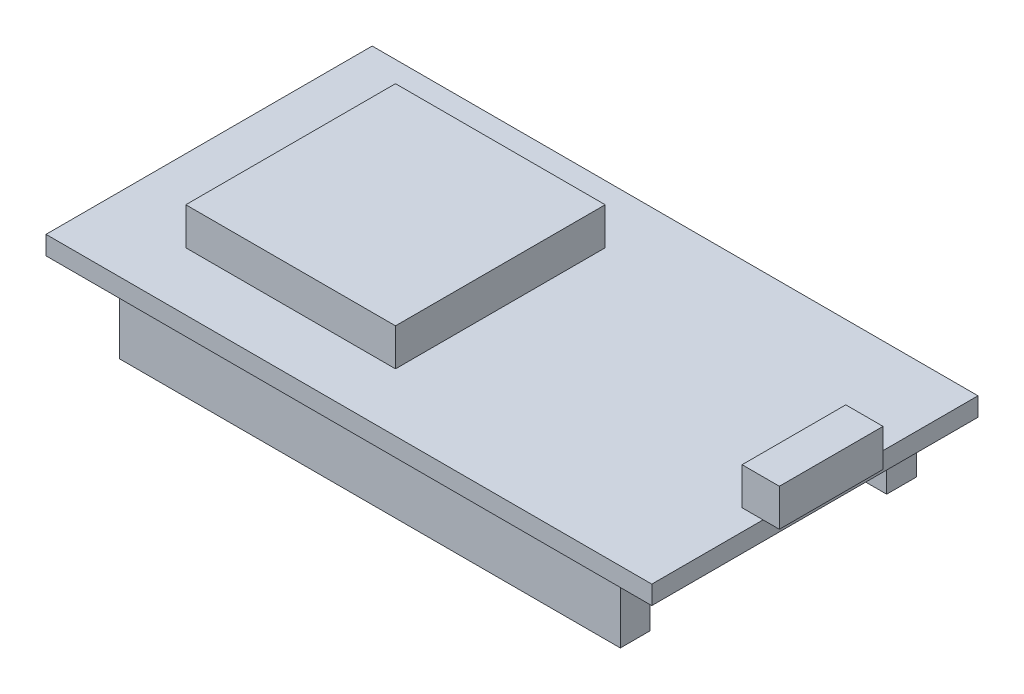
ISO-10303-21;
HEADER;
FILE_DESCRIPTION(('STEP AP214'),'2;1');
FILE_NAME('part.step','',(''),(''),'','','');
FILE_SCHEMA(('AUTOMOTIVE_DESIGN { 1 0 10303 214 1 1 1 1 }'));
ENDSEC;
DATA;
#1=APPLICATION_CONTEXT('core data for automotive mechanical design processes');
#2=APPLICATION_PROTOCOL_DEFINITION('international standard','automotive_design',2000,#1);
#3=PRODUCT_CONTEXT('',#1,'mechanical');
#4=PRODUCT('Part','Part','',(#3));
#5=PRODUCT_RELATED_PRODUCT_CATEGORY('part','',(#4));
#6=PRODUCT_DEFINITION_FORMATION('','',#4);
#7=PRODUCT_DEFINITION_CONTEXT('part definition',#1,'design');
#8=PRODUCT_DEFINITION('design','',#6,#7);
#9=PRODUCT_DEFINITION_SHAPE('','',#8);
#10=(LENGTH_UNIT() NAMED_UNIT(*) SI_UNIT(.MILLI.,.METRE.));
#11=(NAMED_UNIT(*) PLANE_ANGLE_UNIT() SI_UNIT($,.RADIAN.));
#12=(NAMED_UNIT(*) SI_UNIT($,.STERADIAN.) SOLID_ANGLE_UNIT());
#13=UNCERTAINTY_MEASURE_WITH_UNIT(LENGTH_MEASURE(1.E-05),#10,'distance_accuracy_value','');
#14=(GEOMETRIC_REPRESENTATION_CONTEXT(3) GLOBAL_UNCERTAINTY_ASSIGNED_CONTEXT((#13)) GLOBAL_UNIT_ASSIGNED_CONTEXT((#10,
#11,#12)) REPRESENTATION_CONTEXT('',''));
#15=CARTESIAN_POINT('',(0.,0.,0.));
#16=DIRECTION('',(0.,0.,1.));
#17=DIRECTION('',(1.,0.,0.));
#18=AXIS2_PLACEMENT_3D('',#15,#16,#17);
#19=CARTESIAN_POINT('',(0.,10.6,0.));
#20=DIRECTION('',(0.,-1.,0.));
#21=DIRECTION('',(0.,0.,-1.));
#22=AXIS2_PLACEMENT_3D('',#19,#20,#21);
#23=PLANE('',#22);
#24=DIRECTION('',(0.,0.,1.));
#25=VECTOR('',#24,1.);
#26=CARTESIAN_POINT('',(16.,10.6,9.));
#27=LINE('',#26,#25);
#28=CARTESIAN_POINT('',(16.,10.6,-9.));
#29=VERTEX_POINT('',#28);
#30=CARTESIAN_POINT('',(16.,10.6,9.));
#31=VERTEX_POINT('',#30);
#32=EDGE_CURVE('E278',#29,#31,#27,.T.);
#33=ORIENTED_EDGE('',*,*,#32,.F.);
#34=DIRECTION('',(-1.,0.,0.));
#35=VECTOR('',#34,1.);
#36=CARTESIAN_POINT('',(16.,10.6,-9.));
#37=LINE('',#36,#35);
#38=CARTESIAN_POINT('',(34.,10.6,-9.));
#39=VERTEX_POINT('',#38);
#40=EDGE_CURVE('E283',#39,#29,#37,.T.);
#41=ORIENTED_EDGE('',*,*,#40,.F.);
#42=DIRECTION('',(0.,0.,-1.));
#43=VECTOR('',#42,1.);
#44=CARTESIAN_POINT('',(34.,10.6,-9.));
#45=LINE('',#44,#43);
#46=CARTESIAN_POINT('',(34.,10.6,9.));
#47=VERTEX_POINT('',#46);
#48=EDGE_CURVE('E295',#47,#39,#45,.T.);
#49=ORIENTED_EDGE('',*,*,#48,.F.);
#50=DIRECTION('',(1.,0.,0.));
#51=VECTOR('',#50,1.);
#52=CARTESIAN_POINT('',(34.,10.6,9.));
#53=LINE('',#52,#51);
#54=EDGE_CURVE('E292',#31,#47,#53,.T.);
#55=ORIENTED_EDGE('',*,*,#54,.F.);
#56=EDGE_LOOP('',(#33,#41,#49,#55));
#57=FACE_BOUND('',#56,.T.);
#58=DIRECTION('',(1.,0.,0.));
#59=VECTOR('',#58,1.);
#60=CARTESIAN_POINT('',(62.4,10.6,4.45));
#61=LINE('',#60,#59);
#62=CARTESIAN_POINT('',(59.2,10.6,4.45));
#63=VERTEX_POINT('',#62);
#64=CARTESIAN_POINT('',(61.,10.6,4.45));
#65=VERTEX_POINT('',#64);
#66=EDGE_CURVE('E259',#63,#65,#61,.T.);
#67=ORIENTED_EDGE('',*,*,#66,.F.);
#68=DIRECTION('',(0.,0.,1.));
#69=VECTOR('',#68,1.);
#70=CARTESIAN_POINT('',(59.2,10.6,4.45));
#71=LINE('',#70,#69);
#72=CARTESIAN_POINT('',(59.2,10.6,-4.45));
#73=VERTEX_POINT('',#72);
#74=EDGE_CURVE('E236',#73,#63,#71,.T.);
#75=ORIENTED_EDGE('',*,*,#74,.F.);
#76=DIRECTION('',(-1.,0.,0.));
#77=VECTOR('',#76,1.);
#78=CARTESIAN_POINT('',(59.2,10.6,-4.45));
#79=LINE('',#78,#77);
#80=CARTESIAN_POINT('',(61.,10.6,-4.45));
#81=VERTEX_POINT('',#80);
#82=EDGE_CURVE('E264',#81,#73,#79,.T.);
#83=ORIENTED_EDGE('',*,*,#82,.F.);
#84=DIRECTION('',(0.,0.,-1.));
#85=VECTOR('',#84,1.);
#86=CARTESIAN_POINT('',(61.,10.6,-14.));
#87=LINE('',#86,#85);
#88=CARTESIAN_POINT('',(61.,10.6,-14.));
#89=VERTEX_POINT('',#88);
#90=EDGE_CURVE('E318',#81,#89,#87,.T.);
#91=ORIENTED_EDGE('',*,*,#90,.T.);
#92=DIRECTION('',(-1.,0.,0.));
#93=VECTOR('',#92,1.);
#94=CARTESIAN_POINT('',(9.,10.6,-14.));
#95=LINE('',#94,#93);
#96=CARTESIAN_POINT('',(9.,10.6,-14.));
#97=VERTEX_POINT('',#96);
#98=EDGE_CURVE('E322',#89,#97,#95,.T.);
#99=ORIENTED_EDGE('',*,*,#98,.T.);
#100=DIRECTION('',(0.,0.,1.));
#101=VECTOR('',#100,1.);
#102=CARTESIAN_POINT('',(9.,10.6,14.));
#103=LINE('',#102,#101);
#104=CARTESIAN_POINT('',(9.,10.6,14.));
#105=VERTEX_POINT('',#104);
#106=EDGE_CURVE('E312',#97,#105,#103,.T.);
#107=ORIENTED_EDGE('',*,*,#106,.T.);
#108=DIRECTION('',(1.,0.,0.));
#109=VECTOR('',#108,1.);
#110=CARTESIAN_POINT('',(61.,10.6,14.));
#111=LINE('',#110,#109);
#112=CARTESIAN_POINT('',(61.,10.6,14.));
#113=VERTEX_POINT('',#112);
#114=EDGE_CURVE('E315',#105,#113,#111,.T.);
#115=ORIENTED_EDGE('',*,*,#114,.T.);
#116=EDGE_CURVE('E319',#113,#65,#87,.T.);
#117=ORIENTED_EDGE('',*,*,#116,.T.);
#118=EDGE_LOOP('',(#67,#75,#83,#91,#99,#107,#115,#117));
#119=FACE_BOUND('',#118,.T.);
#120=ADVANCED_FACE('F39',(#57,#119),#23,.F.);
#121=CARTESIAN_POINT('',(9.,10.6,14.));
#122=DIRECTION('',(1.,0.,0.));
#123=DIRECTION('',(0.,0.,-1.));
#124=AXIS2_PLACEMENT_3D('',#121,#122,#123);
#125=PLANE('',#124);
#126=DIRECTION('',(0.,0.,1.));
#127=VECTOR('',#126,1.);
#128=CARTESIAN_POINT('',(9.,9.,14.));
#129=LINE('',#128,#127);
#130=CARTESIAN_POINT('',(9.,9.,-14.));
#131=VERTEX_POINT('',#130);
#132=CARTESIAN_POINT('',(9.,9.,14.));
#133=VERTEX_POINT('',#132);
#134=EDGE_CURVE('E311',#131,#133,#129,.T.);
#135=ORIENTED_EDGE('',*,*,#134,.T.);
#136=DIRECTION('',(0.,-1.,0.));
#137=VECTOR('',#136,1.);
#138=CARTESIAN_POINT('',(9.,10.6,14.));
#139=LINE('',#138,#137);
#140=EDGE_CURVE('E11',#105,#133,#139,.T.);
#141=ORIENTED_EDGE('',*,*,#140,.F.);
#142=ORIENTED_EDGE('',*,*,#106,.F.);
#143=DIRECTION('',(0.,-1.,0.));
#144=VECTOR('',#143,1.);
#145=CARTESIAN_POINT('',(9.,10.6,-14.));
#146=LINE('',#145,#144);
#147=EDGE_CURVE('E325',#97,#131,#146,.T.);
#148=ORIENTED_EDGE('',*,*,#147,.T.);
#149=EDGE_LOOP('',(#135,#141,#142,#148));
#150=FACE_BOUND('',#149,.T.);
#151=ADVANCED_FACE('F41',(#150),#125,.F.);
#152=CARTESIAN_POINT('',(61.,10.6,14.));
#153=DIRECTION('',(0.,0.,-1.));
#154=DIRECTION('',(-1.,0.,0.));
#155=AXIS2_PLACEMENT_3D('',#152,#153,#154);
#156=PLANE('',#155);
#157=DIRECTION('',(1.,0.,0.));
#158=VECTOR('',#157,1.);
#159=CARTESIAN_POINT('',(61.,9.,14.));
#160=LINE('',#159,#158);
#161=CARTESIAN_POINT('',(61.,9.,14.));
#162=VERTEX_POINT('',#161);
#163=EDGE_CURVE('E328',#133,#162,#160,.T.);
#164=ORIENTED_EDGE('',*,*,#163,.T.);
#165=DIRECTION('',(0.,-1.,0.));
#166=VECTOR('',#165,1.);
#167=CARTESIAN_POINT('',(61.,10.6,14.));
#168=LINE('',#167,#166);
#169=EDGE_CURVE('E47',#113,#162,#168,.T.);
#170=ORIENTED_EDGE('',*,*,#169,.F.);
#171=ORIENTED_EDGE('',*,*,#114,.F.);
#172=ORIENTED_EDGE('',*,*,#140,.T.);
#173=EDGE_LOOP('',(#164,#170,#171,#172));
#174=FACE_BOUND('',#173,.T.);
#175=ADVANCED_FACE('F402',(#174),#156,.F.);
#176=CARTESIAN_POINT('',(61.,10.6,-14.));
#177=DIRECTION('',(-1.,0.,0.));
#178=DIRECTION('',(0.,0.,1.));
#179=AXIS2_PLACEMENT_3D('',#176,#177,#178);
#180=PLANE('',#179);
#181=DIRECTION('',(0.,0.,-1.));
#182=VECTOR('',#181,1.);
#183=CARTESIAN_POINT('',(61.,9.,-14.));
#184=LINE('',#183,#182);
#185=CARTESIAN_POINT('',(61.,9.,-14.));
#186=VERTEX_POINT('',#185);
#187=EDGE_CURVE('E330',#162,#186,#184,.T.);
#188=ORIENTED_EDGE('',*,*,#187,.T.);
#189=DIRECTION('',(0.,-1.,0.));
#190=VECTOR('',#189,1.);
#191=CARTESIAN_POINT('',(61.,10.6,-14.));
#192=LINE('',#191,#190);
#193=EDGE_CURVE('E335',#89,#186,#192,.T.);
#194=ORIENTED_EDGE('',*,*,#193,.F.);
#195=ORIENTED_EDGE('',*,*,#90,.F.);
#196=EDGE_CURVE('E323',#65,#81,#87,.T.);
#197=ORIENTED_EDGE('',*,*,#196,.F.);
#198=ORIENTED_EDGE('',*,*,#116,.F.);
#199=ORIENTED_EDGE('',*,*,#169,.T.);
#200=EDGE_LOOP('',(#188,#194,#195,#197,#198,#199));
#201=FACE_BOUND('',#200,.T.);
#202=ADVANCED_FACE('F342',(#201),#180,.F.);
#203=CARTESIAN_POINT('',(9.,10.6,-14.));
#204=DIRECTION('',(0.,0.,1.));
#205=DIRECTION('',(1.,0.,0.));
#206=AXIS2_PLACEMENT_3D('',#203,#204,#205);
#207=PLANE('',#206);
#208=DIRECTION('',(-1.,0.,0.));
#209=VECTOR('',#208,1.);
#210=CARTESIAN_POINT('',(9.,9.,-14.));
#211=LINE('',#210,#209);
#212=EDGE_CURVE('E316',#186,#131,#211,.T.);
#213=ORIENTED_EDGE('',*,*,#212,.T.);
#214=ORIENTED_EDGE('',*,*,#147,.F.);
#215=ORIENTED_EDGE('',*,*,#98,.F.);
#216=ORIENTED_EDGE('',*,*,#193,.T.);
#217=EDGE_LOOP('',(#213,#214,#215,#216));
#218=FACE_BOUND('',#217,.T.);
#219=ADVANCED_FACE('F350',(#218),#207,.F.);
#220=CARTESIAN_POINT('',(0.,9.,0.));
#221=DIRECTION('',(0.,-1.,0.));
#222=DIRECTION('',(0.,0.,-1.));
#223=AXIS2_PLACEMENT_3D('',#220,#221,#222);
#224=PLANE('',#223);
#225=DIRECTION('',(0.,0.,1.));
#226=VECTOR('',#225,1.);
#227=CARTESIAN_POINT('',(14.,9.,12.7));
#228=LINE('',#227,#226);
#229=CARTESIAN_POINT('',(14.,9.,10.16));
#230=VERTEX_POINT('',#229);
#231=CARTESIAN_POINT('',(14.,9.,12.7));
#232=VERTEX_POINT('',#231);
#233=EDGE_CURVE('E179',#230,#232,#228,.T.);
#234=ORIENTED_EDGE('',*,*,#233,.T.);
#235=DIRECTION('',(1.,0.,0.));
#236=VECTOR('',#235,1.);
#237=CARTESIAN_POINT('',(57.,9.,12.7));
#238=LINE('',#237,#236);
#239=CARTESIAN_POINT('',(57.,9.,12.7));
#240=VERTEX_POINT('',#239);
#241=EDGE_CURVE('E184',#232,#240,#238,.T.);
#242=ORIENTED_EDGE('',*,*,#241,.T.);
#243=DIRECTION('',(0.,0.,-1.));
#244=VECTOR('',#243,1.);
#245=CARTESIAN_POINT('',(57.,9.,10.16));
#246=LINE('',#245,#244);
#247=CARTESIAN_POINT('',(57.,9.,10.16));
#248=VERTEX_POINT('',#247);
#249=EDGE_CURVE('E59',#240,#248,#246,.T.);
#250=ORIENTED_EDGE('',*,*,#249,.T.);
#251=DIRECTION('',(-1.,0.,0.));
#252=VECTOR('',#251,1.);
#253=CARTESIAN_POINT('',(14.,9.,10.16));
#254=LINE('',#253,#252);
#255=EDGE_CURVE('E54',#248,#230,#254,.T.);
#256=ORIENTED_EDGE('',*,*,#255,.T.);
#257=EDGE_LOOP('',(#234,#242,#250,#256));
#258=FACE_BOUND('',#257,.T.);
#259=DIRECTION('',(0.,0.,1.));
#260=VECTOR('',#259,1.);
#261=CARTESIAN_POINT('',(14.,9.,-10.16));
#262=LINE('',#261,#260);
#263=CARTESIAN_POINT('',(14.,9.,-12.7));
#264=VERTEX_POINT('',#263);
#265=CARTESIAN_POINT('',(14.,9.,-10.16));
#266=VERTEX_POINT('',#265);
#267=EDGE_CURVE('E187',#264,#266,#262,.T.);
#268=ORIENTED_EDGE('',*,*,#267,.T.);
#269=DIRECTION('',(1.,0.,0.));
#270=VECTOR('',#269,1.);
#271=CARTESIAN_POINT('',(57.,9.,-10.16));
#272=LINE('',#271,#270);
#273=CARTESIAN_POINT('',(57.,9.,-10.16));
#274=VERTEX_POINT('',#273);
#275=EDGE_CURVE('E228',#266,#274,#272,.T.);
#276=ORIENTED_EDGE('',*,*,#275,.T.);
#277=DIRECTION('',(0.,0.,-1.));
#278=VECTOR('',#277,1.);
#279=CARTESIAN_POINT('',(57.,9.,-12.7));
#280=LINE('',#279,#278);
#281=CARTESIAN_POINT('',(57.,9.,-12.7));
#282=VERTEX_POINT('',#281);
#283=EDGE_CURVE('E230',#274,#282,#280,.T.);
#284=ORIENTED_EDGE('',*,*,#283,.T.);
#285=DIRECTION('',(-1.,0.,0.));
#286=VECTOR('',#285,1.);
#287=CARTESIAN_POINT('',(14.,9.,-12.7));
#288=LINE('',#287,#286);
#289=EDGE_CURVE('E217',#282,#264,#288,.T.);
#290=ORIENTED_EDGE('',*,*,#289,.T.);
#291=EDGE_LOOP('',(#268,#276,#284,#290));
#292=FACE_BOUND('',#291,.T.);
#293=ORIENTED_EDGE('',*,*,#134,.F.);
#294=ORIENTED_EDGE('',*,*,#212,.F.);
#295=ORIENTED_EDGE('',*,*,#187,.F.);
#296=ORIENTED_EDGE('',*,*,#163,.F.);
#297=EDGE_LOOP('',(#293,#294,#295,#296));
#298=FACE_BOUND('',#297,.T.);
#299=ADVANCED_FACE('F181',(#258,#292,#298),#224,.T.);
#300=CARTESIAN_POINT('',(16.,13.8,9.));
#301=DIRECTION('',(1.,0.,0.));
#302=DIRECTION('',(0.,0.,-1.));
#303=AXIS2_PLACEMENT_3D('',#300,#301,#302);
#304=PLANE('',#303);
#305=ORIENTED_EDGE('',*,*,#32,.T.);
#306=DIRECTION('',(0.,-1.,0.));
#307=VECTOR('',#306,1.);
#308=CARTESIAN_POINT('',(16.,13.8,9.));
#309=LINE('',#308,#307);
#310=CARTESIAN_POINT('',(16.,13.8,9.));
#311=VERTEX_POINT('',#310);
#312=EDGE_CURVE('E308',#311,#31,#309,.T.);
#313=ORIENTED_EDGE('',*,*,#312,.F.);
#314=DIRECTION('',(0.,0.,1.));
#315=VECTOR('',#314,1.);
#316=CARTESIAN_POINT('',(16.,13.8,9.));
#317=LINE('',#316,#315);
#318=CARTESIAN_POINT('',(16.,13.8,-9.));
#319=VERTEX_POINT('',#318);
#320=EDGE_CURVE('E279',#319,#311,#317,.T.);
#321=ORIENTED_EDGE('',*,*,#320,.F.);
#322=DIRECTION('',(0.,-1.,0.));
#323=VECTOR('',#322,1.);
#324=CARTESIAN_POINT('',(16.,13.8,-9.));
#325=LINE('',#324,#323);
#326=EDGE_CURVE('E289',#319,#29,#325,.T.);
#327=ORIENTED_EDGE('',*,*,#326,.T.);
#328=EDGE_LOOP('',(#305,#313,#321,#327));
#329=FACE_BOUND('',#328,.T.);
#330=ADVANCED_FACE('F405',(#329),#304,.F.);
#331=CARTESIAN_POINT('',(34.,13.8,9.));
#332=DIRECTION('',(0.,0.,-1.));
#333=DIRECTION('',(-1.,0.,0.));
#334=AXIS2_PLACEMENT_3D('',#331,#332,#333);
#335=PLANE('',#334);
#336=ORIENTED_EDGE('',*,*,#54,.T.);
#337=DIRECTION('',(0.,-1.,0.));
#338=VECTOR('',#337,1.);
#339=CARTESIAN_POINT('',(34.,13.8,9.));
#340=LINE('',#339,#338);
#341=CARTESIAN_POINT('',(34.,13.8,9.));
#342=VERTEX_POINT('',#341);
#343=EDGE_CURVE('E305',#342,#47,#340,.T.);
#344=ORIENTED_EDGE('',*,*,#343,.F.);
#345=DIRECTION('',(1.,0.,0.));
#346=VECTOR('',#345,1.);
#347=CARTESIAN_POINT('',(34.,13.8,9.));
#348=LINE('',#347,#346);
#349=EDGE_CURVE('E282',#311,#342,#348,.T.);
#350=ORIENTED_EDGE('',*,*,#349,.F.);
#351=ORIENTED_EDGE('',*,*,#312,.T.);
#352=EDGE_LOOP('',(#336,#344,#350,#351));
#353=FACE_BOUND('',#352,.T.);
#354=ADVANCED_FACE('F429',(#353),#335,.F.);
#355=CARTESIAN_POINT('',(34.,13.8,-9.));
#356=DIRECTION('',(-1.,0.,0.));
#357=DIRECTION('',(0.,0.,1.));
#358=AXIS2_PLACEMENT_3D('',#355,#356,#357);
#359=PLANE('',#358);
#360=ORIENTED_EDGE('',*,*,#48,.T.);
#361=DIRECTION('',(0.,-1.,0.));
#362=VECTOR('',#361,1.);
#363=CARTESIAN_POINT('',(34.,13.8,-9.));
#364=LINE('',#363,#362);
#365=CARTESIAN_POINT('',(34.,13.8,-9.));
#366=VERTEX_POINT('',#365);
#367=EDGE_CURVE('E302',#366,#39,#364,.T.);
#368=ORIENTED_EDGE('',*,*,#367,.F.);
#369=DIRECTION('',(0.,0.,-1.));
#370=VECTOR('',#369,1.);
#371=CARTESIAN_POINT('',(34.,13.8,-9.));
#372=LINE('',#371,#370);
#373=EDGE_CURVE('E285',#342,#366,#372,.T.);
#374=ORIENTED_EDGE('',*,*,#373,.F.);
#375=ORIENTED_EDGE('',*,*,#343,.T.);
#376=EDGE_LOOP('',(#360,#368,#374,#375));
#377=FACE_BOUND('',#376,.T.);
#378=ADVANCED_FACE('F437',(#377),#359,.F.);
#379=CARTESIAN_POINT('',(16.,13.8,-9.));
#380=DIRECTION('',(0.,0.,1.));
#381=DIRECTION('',(1.,0.,0.));
#382=AXIS2_PLACEMENT_3D('',#379,#380,#381);
#383=PLANE('',#382);
#384=ORIENTED_EDGE('',*,*,#40,.T.);
#385=ORIENTED_EDGE('',*,*,#326,.F.);
#386=DIRECTION('',(-1.,0.,0.));
#387=VECTOR('',#386,1.);
#388=CARTESIAN_POINT('',(16.,13.8,-9.));
#389=LINE('',#388,#387);
#390=EDGE_CURVE('E287',#366,#319,#389,.T.);
#391=ORIENTED_EDGE('',*,*,#390,.F.);
#392=ORIENTED_EDGE('',*,*,#367,.T.);
#393=EDGE_LOOP('',(#384,#385,#391,#392));
#394=FACE_BOUND('',#393,.T.);
#395=ADVANCED_FACE('F445',(#394),#383,.F.);
#396=CARTESIAN_POINT('',(0.,13.8,0.));
#397=DIRECTION('',(0.,-1.,0.));
#398=DIRECTION('',(0.,0.,-1.));
#399=AXIS2_PLACEMENT_3D('',#396,#397,#398);
#400=PLANE('',#399);
#401=ORIENTED_EDGE('',*,*,#320,.T.);
#402=ORIENTED_EDGE('',*,*,#349,.T.);
#403=ORIENTED_EDGE('',*,*,#373,.T.);
#404=ORIENTED_EDGE('',*,*,#390,.T.);
#405=EDGE_LOOP('',(#401,#402,#403,#404));
#406=FACE_BOUND('',#405,.T.);
#407=ADVANCED_FACE('F453',(#406),#400,.F.);
#408=CARTESIAN_POINT('',(0.,10.6,0.));
#409=DIRECTION('',(0.,-1.,0.));
#410=DIRECTION('',(0.,0.,-1.));
#411=AXIS2_PLACEMENT_3D('',#408,#409,#410);
#412=PLANE('',#411);
#413=ORIENTED_EDGE('',*,*,#196,.T.);
#414=CARTESIAN_POINT('',(62.4,10.6,-4.45));
#415=VERTEX_POINT('',#414);
#416=EDGE_CURVE('E249',#415,#81,#79,.T.);
#417=ORIENTED_EDGE('',*,*,#416,.F.);
#418=DIRECTION('',(0.,0.,-1.));
#419=VECTOR('',#418,1.);
#420=CARTESIAN_POINT('',(62.4,10.6,-4.45));
#421=LINE('',#420,#419);
#422=CARTESIAN_POINT('',(62.4,10.6,4.45));
#423=VERTEX_POINT('',#422);
#424=EDGE_CURVE('E262',#423,#415,#421,.T.);
#425=ORIENTED_EDGE('',*,*,#424,.F.);
#426=EDGE_CURVE('E258',#65,#423,#61,.T.);
#427=ORIENTED_EDGE('',*,*,#426,.F.);
#428=EDGE_LOOP('',(#413,#417,#425,#427));
#429=FACE_BOUND('',#428,.T.);
#430=ADVANCED_FACE('F362',(#429),#412,.T.);
#431=CARTESIAN_POINT('',(59.2,13.8,4.45));
#432=DIRECTION('',(1.,0.,0.));
#433=DIRECTION('',(0.,0.,-1.));
#434=AXIS2_PLACEMENT_3D('',#431,#432,#433);
#435=PLANE('',#434);
#436=ORIENTED_EDGE('',*,*,#74,.T.);
#437=DIRECTION('',(0.,-1.,0.));
#438=VECTOR('',#437,1.);
#439=CARTESIAN_POINT('',(59.2,13.8,4.45));
#440=LINE('',#439,#438);
#441=CARTESIAN_POINT('',(59.2,13.8,4.45));
#442=VERTEX_POINT('',#441);
#443=EDGE_CURVE('E275',#442,#63,#440,.T.);
#444=ORIENTED_EDGE('',*,*,#443,.F.);
#445=DIRECTION('',(0.,0.,1.));
#446=VECTOR('',#445,1.);
#447=CARTESIAN_POINT('',(59.2,13.8,4.45));
#448=LINE('',#447,#446);
#449=CARTESIAN_POINT('',(59.2,13.8,-4.45));
#450=VERTEX_POINT('',#449);
#451=EDGE_CURVE('E245',#450,#442,#448,.T.);
#452=ORIENTED_EDGE('',*,*,#451,.F.);
#453=DIRECTION('',(0.,-1.,0.));
#454=VECTOR('',#453,1.);
#455=CARTESIAN_POINT('',(59.2,13.8,-4.45));
#456=LINE('',#455,#454);
#457=EDGE_CURVE('E255',#450,#73,#456,.T.);
#458=ORIENTED_EDGE('',*,*,#457,.T.);
#459=EDGE_LOOP('',(#436,#444,#452,#458));
#460=FACE_BOUND('',#459,.T.);
#461=ADVANCED_FACE('F377',(#460),#435,.F.);
#462=CARTESIAN_POINT('',(62.4,13.8,4.45));
#463=DIRECTION('',(0.,0.,-1.));
#464=DIRECTION('',(-1.,0.,0.));
#465=AXIS2_PLACEMENT_3D('',#462,#463,#464);
#466=PLANE('',#465);
#467=ORIENTED_EDGE('',*,*,#66,.T.);
#468=ORIENTED_EDGE('',*,*,#426,.T.);
#469=DIRECTION('',(0.,-1.,0.));
#470=VECTOR('',#469,1.);
#471=CARTESIAN_POINT('',(62.4,13.8,4.45));
#472=LINE('',#471,#470);
#473=CARTESIAN_POINT('',(62.4,13.8,4.45));
#474=VERTEX_POINT('',#473);
#475=EDGE_CURVE('E272',#474,#423,#472,.T.);
#476=ORIENTED_EDGE('',*,*,#475,.F.);
#477=DIRECTION('',(1.,0.,0.));
#478=VECTOR('',#477,1.);
#479=CARTESIAN_POINT('',(62.4,13.8,4.45));
#480=LINE('',#479,#478);
#481=EDGE_CURVE('E248',#442,#474,#480,.T.);
#482=ORIENTED_EDGE('',*,*,#481,.F.);
#483=ORIENTED_EDGE('',*,*,#443,.T.);
#484=EDGE_LOOP('',(#467,#468,#476,#482,#483));
#485=FACE_BOUND('',#484,.T.);
#486=ADVANCED_FACE('F374',(#485),#466,.F.);
#487=CARTESIAN_POINT('',(62.4,13.8,-4.45));
#488=DIRECTION('',(-1.,0.,0.));
#489=DIRECTION('',(0.,0.,1.));
#490=AXIS2_PLACEMENT_3D('',#487,#488,#489);
#491=PLANE('',#490);
#492=ORIENTED_EDGE('',*,*,#424,.T.);
#493=DIRECTION('',(0.,-1.,0.));
#494=VECTOR('',#493,1.);
#495=CARTESIAN_POINT('',(62.4,13.8,-4.45));
#496=LINE('',#495,#494);
#497=CARTESIAN_POINT('',(62.4,13.8,-4.45));
#498=VERTEX_POINT('',#497);
#499=EDGE_CURVE('E269',#498,#415,#496,.T.);
#500=ORIENTED_EDGE('',*,*,#499,.F.);
#501=DIRECTION('',(0.,0.,-1.));
#502=VECTOR('',#501,1.);
#503=CARTESIAN_POINT('',(62.4,13.8,-4.45));
#504=LINE('',#503,#502);
#505=EDGE_CURVE('E251',#474,#498,#504,.T.);
#506=ORIENTED_EDGE('',*,*,#505,.F.);
#507=ORIENTED_EDGE('',*,*,#475,.T.);
#508=EDGE_LOOP('',(#492,#500,#506,#507));
#509=FACE_BOUND('',#508,.T.);
#510=ADVANCED_FACE('F371',(#509),#491,.F.);
#511=CARTESIAN_POINT('',(59.2,13.8,-4.45));
#512=DIRECTION('',(0.,0.,1.));
#513=DIRECTION('',(1.,0.,0.));
#514=AXIS2_PLACEMENT_3D('',#511,#512,#513);
#515=PLANE('',#514);
#516=ORIENTED_EDGE('',*,*,#416,.T.);
#517=ORIENTED_EDGE('',*,*,#82,.T.);
#518=ORIENTED_EDGE('',*,*,#457,.F.);
#519=DIRECTION('',(-1.,0.,0.));
#520=VECTOR('',#519,1.);
#521=CARTESIAN_POINT('',(59.2,13.8,-4.45));
#522=LINE('',#521,#520);
#523=EDGE_CURVE('E253',#498,#450,#522,.T.);
#524=ORIENTED_EDGE('',*,*,#523,.F.);
#525=ORIENTED_EDGE('',*,*,#499,.T.);
#526=EDGE_LOOP('',(#516,#517,#518,#524,#525));
#527=FACE_BOUND('',#526,.T.);
#528=ADVANCED_FACE('F365',(#527),#515,.F.);
#529=CARTESIAN_POINT('',(0.,13.8,0.));
#530=DIRECTION('',(0.,-1.,0.));
#531=DIRECTION('',(0.,0.,-1.));
#532=AXIS2_PLACEMENT_3D('',#529,#530,#531);
#533=PLANE('',#532);
#534=ORIENTED_EDGE('',*,*,#451,.T.);
#535=ORIENTED_EDGE('',*,*,#481,.T.);
#536=ORIENTED_EDGE('',*,*,#505,.T.);
#537=ORIENTED_EDGE('',*,*,#523,.T.);
#538=EDGE_LOOP('',(#534,#535,#536,#537));
#539=FACE_BOUND('',#538,.T.);
#540=ADVANCED_FACE('F380',(#539),#533,.F.);
#541=CARTESIAN_POINT('',(14.,3.2,-10.16));
#542=DIRECTION('',(-1.,0.,0.));
#543=DIRECTION('',(0.,0.,1.));
#544=AXIS2_PLACEMENT_3D('',#541,#542,#543);
#545=PLANE('',#544);
#546=ORIENTED_EDGE('',*,*,#267,.F.);
#547=DIRECTION('',(0.,1.,0.));
#548=VECTOR('',#547,1.);
#549=CARTESIAN_POINT('',(14.,3.2,-12.7));
#550=LINE('',#549,#548);
#551=CARTESIAN_POINT('',(14.,3.2,-12.7));
#552=VERTEX_POINT('',#551);
#553=EDGE_CURVE('E233',#552,#264,#550,.T.);
#554=ORIENTED_EDGE('',*,*,#553,.F.);
#555=DIRECTION('',(0.,0.,1.));
#556=VECTOR('',#555,1.);
#557=CARTESIAN_POINT('',(14.,3.2,-10.16));
#558=LINE('',#557,#556);
#559=CARTESIAN_POINT('',(14.,3.2,-10.16));
#560=VERTEX_POINT('',#559);
#561=EDGE_CURVE('E213',#552,#560,#558,.T.);
#562=ORIENTED_EDGE('',*,*,#561,.T.);
#563=DIRECTION('',(0.,1.,0.));
#564=VECTOR('',#563,1.);
#565=CARTESIAN_POINT('',(14.,3.2,-10.16));
#566=LINE('',#565,#564);
#567=EDGE_CURVE('E226',#560,#266,#566,.T.);
#568=ORIENTED_EDGE('',*,*,#567,.T.);
#569=EDGE_LOOP('',(#546,#554,#562,#568));
#570=FACE_BOUND('',#569,.T.);
#571=ADVANCED_FACE('F382',(#570),#545,.T.);
#572=CARTESIAN_POINT('',(14.,3.2,-12.7));
#573=DIRECTION('',(0.,0.,-1.));
#574=DIRECTION('',(-1.,0.,0.));
#575=AXIS2_PLACEMENT_3D('',#572,#573,#574);
#576=PLANE('',#575);
#577=ORIENTED_EDGE('',*,*,#289,.F.);
#578=DIRECTION('',(0.,1.,0.));
#579=VECTOR('',#578,1.);
#580=CARTESIAN_POINT('',(57.,3.2,-12.7));
#581=LINE('',#580,#579);
#582=CARTESIAN_POINT('',(57.,3.2,-12.7));
#583=VERTEX_POINT('',#582);
#584=EDGE_CURVE('E237',#583,#282,#581,.T.);
#585=ORIENTED_EDGE('',*,*,#584,.F.);
#586=DIRECTION('',(-1.,0.,0.));
#587=VECTOR('',#586,1.);
#588=CARTESIAN_POINT('',(14.,3.2,-12.7));
#589=LINE('',#588,#587);
#590=EDGE_CURVE('E223',#583,#552,#589,.T.);
#591=ORIENTED_EDGE('',*,*,#590,.T.);
#592=ORIENTED_EDGE('',*,*,#553,.T.);
#593=EDGE_LOOP('',(#577,#585,#591,#592));
#594=FACE_BOUND('',#593,.T.);
#595=ADVANCED_FACE('F389',(#594),#576,.T.);
#596=CARTESIAN_POINT('',(57.,3.2,-12.7));
#597=DIRECTION('',(1.,0.,0.));
#598=DIRECTION('',(0.,0.,-1.));
#599=AXIS2_PLACEMENT_3D('',#596,#597,#598);
#600=PLANE('',#599);
#601=ORIENTED_EDGE('',*,*,#283,.F.);
#602=DIRECTION('',(0.,1.,0.));
#603=VECTOR('',#602,1.);
#604=CARTESIAN_POINT('',(57.,3.2,-10.16));
#605=LINE('',#604,#603);
#606=CARTESIAN_POINT('',(57.,3.2,-10.16));
#607=VERTEX_POINT('',#606);
#608=EDGE_CURVE('E240',#607,#274,#605,.T.);
#609=ORIENTED_EDGE('',*,*,#608,.F.);
#610=DIRECTION('',(0.,0.,-1.));
#611=VECTOR('',#610,1.);
#612=CARTESIAN_POINT('',(57.,3.2,-12.7));
#613=LINE('',#612,#611);
#614=EDGE_CURVE('E220',#607,#583,#613,.T.);
#615=ORIENTED_EDGE('',*,*,#614,.T.);
#616=ORIENTED_EDGE('',*,*,#584,.T.);
#617=EDGE_LOOP('',(#601,#609,#615,#616));
#618=FACE_BOUND('',#617,.T.);
#619=ADVANCED_FACE('F524',(#618),#600,.T.);
#620=CARTESIAN_POINT('',(57.,3.2,-10.16));
#621=DIRECTION('',(0.,0.,1.));
#622=DIRECTION('',(1.,0.,0.));
#623=AXIS2_PLACEMENT_3D('',#620,#621,#622);
#624=PLANE('',#623);
#625=ORIENTED_EDGE('',*,*,#275,.F.);
#626=ORIENTED_EDGE('',*,*,#567,.F.);
#627=DIRECTION('',(1.,0.,0.));
#628=VECTOR('',#627,1.);
#629=CARTESIAN_POINT('',(57.,3.2,-10.16));
#630=LINE('',#629,#628);
#631=EDGE_CURVE('E216',#560,#607,#630,.T.);
#632=ORIENTED_EDGE('',*,*,#631,.T.);
#633=ORIENTED_EDGE('',*,*,#608,.T.);
#634=EDGE_LOOP('',(#625,#626,#632,#633));
#635=FACE_BOUND('',#634,.T.);
#636=ADVANCED_FACE('F534',(#635),#624,.T.);
#637=CARTESIAN_POINT('',(0.,3.2,0.));
#638=DIRECTION('',(0.,-1.,0.));
#639=DIRECTION('',(0.,0.,-1.));
#640=AXIS2_PLACEMENT_3D('',#637,#638,#639);
#641=PLANE('',#640);
#642=ORIENTED_EDGE('',*,*,#561,.F.);
#643=ORIENTED_EDGE('',*,*,#590,.F.);
#644=ORIENTED_EDGE('',*,*,#614,.F.);
#645=ORIENTED_EDGE('',*,*,#631,.F.);
#646=EDGE_LOOP('',(#642,#643,#644,#645));
#647=FACE_BOUND('',#646,.T.);
#648=ADVANCED_FACE('F544',(#647),#641,.T.);
#649=CARTESIAN_POINT('',(14.,3.2,12.7));
#650=DIRECTION('',(-1.,0.,0.));
#651=DIRECTION('',(0.,0.,1.));
#652=AXIS2_PLACEMENT_3D('',#649,#650,#651);
#653=PLANE('',#652);
#654=ORIENTED_EDGE('',*,*,#233,.F.);
#655=DIRECTION('',(0.,1.,0.));
#656=VECTOR('',#655,1.);
#657=CARTESIAN_POINT('',(14.,3.2,10.16));
#658=LINE('',#657,#656);
#659=CARTESIAN_POINT('',(14.,3.2,10.16));
#660=VERTEX_POINT('',#659);
#661=EDGE_CURVE('E605',#660,#230,#658,.T.);
#662=ORIENTED_EDGE('',*,*,#661,.F.);
#663=DIRECTION('',(0.,0.,1.));
#664=VECTOR('',#663,1.);
#665=CARTESIAN_POINT('',(14.,3.2,12.7));
#666=LINE('',#665,#664);
#667=CARTESIAN_POINT('',(14.,3.2,12.7));
#668=VERTEX_POINT('',#667);
#669=EDGE_CURVE('E193',#660,#668,#666,.T.);
#670=ORIENTED_EDGE('',*,*,#669,.T.);
#671=DIRECTION('',(0.,1.,0.));
#672=VECTOR('',#671,1.);
#673=CARTESIAN_POINT('',(14.,3.2,12.7));
#674=LINE('',#673,#672);
#675=EDGE_CURVE('E190',#668,#232,#674,.T.);
#676=ORIENTED_EDGE('',*,*,#675,.T.);
#677=EDGE_LOOP('',(#654,#662,#670,#676));
#678=FACE_BOUND('',#677,.T.);
#679=ADVANCED_FACE('F191',(#678),#653,.T.);
#680=CARTESIAN_POINT('',(14.,3.2,10.16));
#681=DIRECTION('',(0.,0.,-1.));
#682=DIRECTION('',(-1.,0.,0.));
#683=AXIS2_PLACEMENT_3D('',#680,#681,#682);
#684=PLANE('',#683);
#685=ORIENTED_EDGE('',*,*,#255,.F.);
#686=DIRECTION('',(0.,1.,0.));
#687=VECTOR('',#686,1.);
#688=CARTESIAN_POINT('',(57.,3.2,10.16));
#689=LINE('',#688,#687);
#690=CARTESIAN_POINT('',(57.,3.2,10.16));
#691=VERTEX_POINT('',#690);
#692=EDGE_CURVE('E606',#691,#248,#689,.T.);
#693=ORIENTED_EDGE('',*,*,#692,.F.);
#694=DIRECTION('',(-1.,0.,0.));
#695=VECTOR('',#694,1.);
#696=CARTESIAN_POINT('',(14.,3.2,10.16));
#697=LINE('',#696,#695);
#698=EDGE_CURVE('E197',#691,#660,#697,.T.);
#699=ORIENTED_EDGE('',*,*,#698,.T.);
#700=ORIENTED_EDGE('',*,*,#661,.T.);
#701=EDGE_LOOP('',(#685,#693,#699,#700));
#702=FACE_BOUND('',#701,.T.);
#703=ADVANCED_FACE('F563',(#702),#684,.T.);
#704=CARTESIAN_POINT('',(57.,3.2,10.16));
#705=DIRECTION('',(1.,0.,0.));
#706=DIRECTION('',(0.,0.,-1.));
#707=AXIS2_PLACEMENT_3D('',#704,#705,#706);
#708=PLANE('',#707);
#709=ORIENTED_EDGE('',*,*,#249,.F.);
#710=DIRECTION('',(0.,1.,0.));
#711=VECTOR('',#710,1.);
#712=CARTESIAN_POINT('',(57.,3.2,12.7));
#713=LINE('',#712,#711);
#714=CARTESIAN_POINT('',(57.,3.2,12.7));
#715=VERTEX_POINT('',#714);
#716=EDGE_CURVE('E198',#715,#240,#713,.T.);
#717=ORIENTED_EDGE('',*,*,#716,.F.);
#718=DIRECTION('',(0.,0.,-1.));
#719=VECTOR('',#718,1.);
#720=CARTESIAN_POINT('',(57.,3.2,10.16));
#721=LINE('',#720,#719);
#722=EDGE_CURVE('E207',#715,#691,#721,.T.);
#723=ORIENTED_EDGE('',*,*,#722,.T.);
#724=ORIENTED_EDGE('',*,*,#692,.T.);
#725=EDGE_LOOP('',(#709,#717,#723,#724));
#726=FACE_BOUND('',#725,.T.);
#727=ADVANCED_FACE('F572',(#726),#708,.T.);
#728=CARTESIAN_POINT('',(57.,3.2,12.7));
#729=DIRECTION('',(0.,0.,1.));
#730=DIRECTION('',(1.,0.,0.));
#731=AXIS2_PLACEMENT_3D('',#728,#729,#730);
#732=PLANE('',#731);
#733=ORIENTED_EDGE('',*,*,#241,.F.);
#734=ORIENTED_EDGE('',*,*,#675,.F.);
#735=DIRECTION('',(1.,0.,0.));
#736=VECTOR('',#735,1.);
#737=CARTESIAN_POINT('',(57.,3.2,12.7));
#738=LINE('',#737,#736);
#739=EDGE_CURVE('E210',#668,#715,#738,.T.);
#740=ORIENTED_EDGE('',*,*,#739,.T.);
#741=ORIENTED_EDGE('',*,*,#716,.T.);
#742=EDGE_LOOP('',(#733,#734,#740,#741));
#743=FACE_BOUND('',#742,.T.);
#744=ADVANCED_FACE('F200',(#743),#732,.T.);
#745=CARTESIAN_POINT('',(0.,3.2,0.));
#746=DIRECTION('',(0.,-1.,0.));
#747=DIRECTION('',(0.,0.,-1.));
#748=AXIS2_PLACEMENT_3D('',#745,#746,#747);
#749=PLANE('',#748);
#750=ORIENTED_EDGE('',*,*,#669,.F.);
#751=ORIENTED_EDGE('',*,*,#698,.F.);
#752=ORIENTED_EDGE('',*,*,#722,.F.);
#753=ORIENTED_EDGE('',*,*,#739,.F.);
#754=EDGE_LOOP('',(#750,#751,#752,#753));
#755=FACE_BOUND('',#754,.T.);
#756=ADVANCED_FACE('F591',(#755),#749,.T.);
#757=CLOSED_SHELL('',(#120,#151,#175,#202,#219,#299,#330,#354,#378,#395,#407,#430,#461,#486,
#510,#528,#540,#571,#595,#619,#636,#648,#679,#703,#727,#744,#756));
#758=MANIFOLD_SOLID_BREP('B2',#757);
#759=ADVANCED_BREP_SHAPE_REPRESENTATION('',(#18,#758),#14);
#760=SHAPE_DEFINITION_REPRESENTATION(#9,#759);
ENDSEC;
END-ISO-10303-21;
